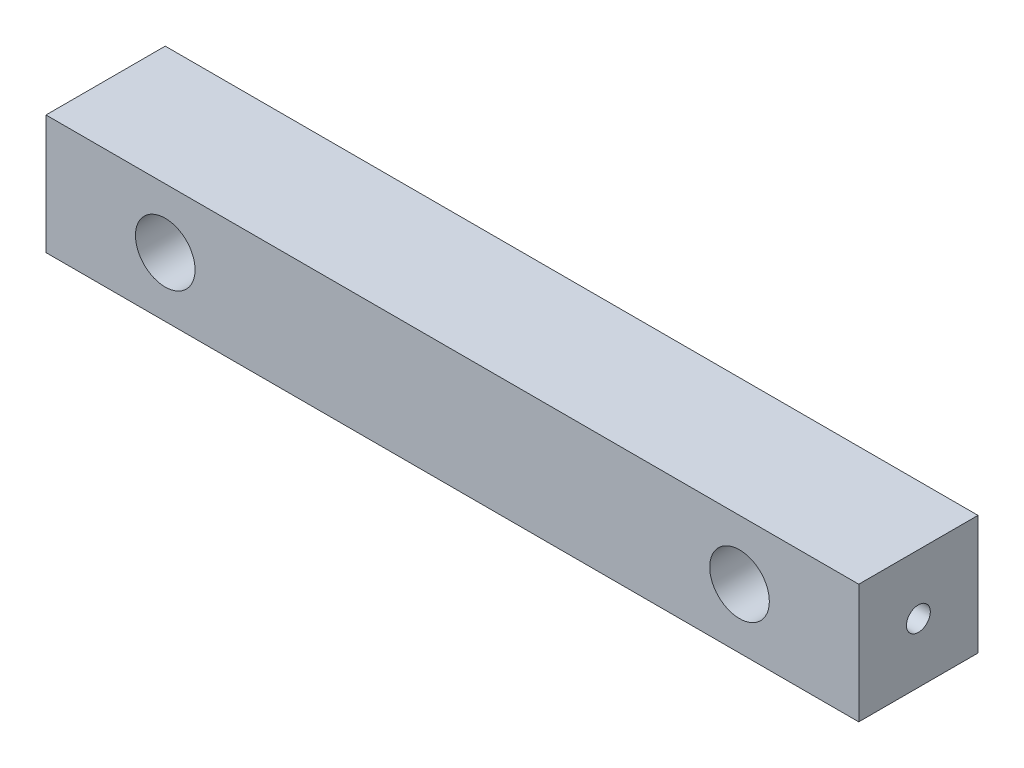
ISO-10303-21;
HEADER;
FILE_DESCRIPTION(('STEP AP214'),'2;1');
FILE_NAME('part.step','',(''),(''),'','','');
FILE_SCHEMA(('AUTOMOTIVE_DESIGN { 1 0 10303 214 1 1 1 1 }'));
ENDSEC;
DATA;
#1=APPLICATION_CONTEXT('core data for automotive mechanical design processes');
#2=APPLICATION_PROTOCOL_DEFINITION('international standard','automotive_design',2000,#1);
#3=PRODUCT_CONTEXT('',#1,'mechanical');
#4=PRODUCT('Part','Part','',(#3));
#5=PRODUCT_RELATED_PRODUCT_CATEGORY('part','',(#4));
#6=PRODUCT_DEFINITION_FORMATION('','',#4);
#7=PRODUCT_DEFINITION_CONTEXT('part definition',#1,'design');
#8=PRODUCT_DEFINITION('design','',#6,#7);
#9=PRODUCT_DEFINITION_SHAPE('','',#8);
#10=(LENGTH_UNIT() NAMED_UNIT(*) SI_UNIT(.MILLI.,.METRE.));
#11=(NAMED_UNIT(*) PLANE_ANGLE_UNIT() SI_UNIT($,.RADIAN.));
#12=(NAMED_UNIT(*) SI_UNIT($,.STERADIAN.) SOLID_ANGLE_UNIT());
#13=UNCERTAINTY_MEASURE_WITH_UNIT(LENGTH_MEASURE(1.E-05),#10,'distance_accuracy_value','');
#14=(GEOMETRIC_REPRESENTATION_CONTEXT(3) GLOBAL_UNCERTAINTY_ASSIGNED_CONTEXT((#13)) GLOBAL_UNIT_ASSIGNED_CONTEXT((#10,
#11,#12)) REPRESENTATION_CONTEXT('',''));
#15=CARTESIAN_POINT('',(0.,0.,0.));
#16=DIRECTION('',(0.,0.,1.));
#17=DIRECTION('',(1.,0.,0.));
#18=AXIS2_PLACEMENT_3D('',#15,#16,#17);
#19=CARTESIAN_POINT('',(0.,0.,20.));
#20=DIRECTION('',(0.,0.,-1.));
#21=DIRECTION('',(-1.,0.,0.));
#22=AXIS2_PLACEMENT_3D('',#19,#20,#21);
#23=PLANE('',#22);
#24=DIRECTION('',(0.,-1.,0.));
#25=VECTOR('',#24,1.);
#26=CARTESIAN_POINT('',(0.,0.,20.));
#27=LINE('',#26,#25);
#28=CARTESIAN_POINT('',(0.,20.,20.));
#29=VERTEX_POINT('',#28);
#30=CARTESIAN_POINT('',(0.,0.,20.));
#31=VERTEX_POINT('',#30);
#32=EDGE_CURVE('E85',#29,#31,#27,.T.);
#33=ORIENTED_EDGE('',*,*,#32,.T.);
#34=DIRECTION('',(1.,0.,0.));
#35=VECTOR('',#34,1.);
#36=CARTESIAN_POINT('',(0.,0.,20.));
#37=LINE('',#36,#35);
#38=CARTESIAN_POINT('',(136.32,0.,20.));
#39=VERTEX_POINT('',#38);
#40=EDGE_CURVE('E80',#31,#39,#37,.T.);
#41=ORIENTED_EDGE('',*,*,#40,.T.);
#42=DIRECTION('',(0.,1.,0.));
#43=VECTOR('',#42,1.);
#44=CARTESIAN_POINT('',(136.32,0.,20.));
#45=LINE('',#44,#43);
#46=CARTESIAN_POINT('',(136.32,20.,20.));
#47=VERTEX_POINT('',#46);
#48=EDGE_CURVE('E83',#39,#47,#45,.T.);
#49=ORIENTED_EDGE('',*,*,#48,.T.);
#50=DIRECTION('',(-1.,0.,0.));
#51=VECTOR('',#50,1.);
#52=CARTESIAN_POINT('',(0.,20.,20.));
#53=LINE('',#52,#51);
#54=EDGE_CURVE('E50',#47,#29,#53,.T.);
#55=ORIENTED_EDGE('',*,*,#54,.T.);
#56=EDGE_LOOP('',(#33,#41,#49,#55));
#57=FACE_BOUND('',#56,.T.);
#58=CARTESIAN_POINT('',(116.32,10.,20.));
#59=DIRECTION('',(0.,0.,1.));
#60=DIRECTION('',(1.,0.,0.));
#61=AXIS2_PLACEMENT_3D('',#58,#59,#60);
#62=CIRCLE('',#61,5.);
#63=CARTESIAN_POINT('',(121.32,10.,20.));
#64=VERTEX_POINT('',#63);
#65=EDGE_CURVE('E100',#64,#64,#62,.T.);
#66=ORIENTED_EDGE('',*,*,#65,.F.);
#67=EDGE_LOOP('',(#66));
#68=FACE_BOUND('',#67,.T.);
#69=CARTESIAN_POINT('',(20.,10.,20.));
#70=DIRECTION('',(0.,0.,1.));
#71=DIRECTION('',(1.,0.,0.));
#72=AXIS2_PLACEMENT_3D('',#69,#70,#71);
#73=CIRCLE('',#72,5.);
#74=CARTESIAN_POINT('',(25.,10.,20.));
#75=VERTEX_POINT('',#74);
#76=EDGE_CURVE('E115',#75,#75,#73,.T.);
#77=ORIENTED_EDGE('',*,*,#76,.F.);
#78=EDGE_LOOP('',(#77));
#79=FACE_BOUND('',#78,.T.);
#80=ADVANCED_FACE('F33',(#57,#68,#79),#23,.F.);
#81=CARTESIAN_POINT('',(0.,0.,0.));
#82=DIRECTION('',(0.,0.,-1.));
#83=DIRECTION('',(-1.,0.,0.));
#84=AXIS2_PLACEMENT_3D('',#81,#82,#83);
#85=PLANE('',#84);
#86=CARTESIAN_POINT('',(116.32,10.,0.));
#87=DIRECTION('',(0.,0.,1.));
#88=DIRECTION('',(1.,0.,0.));
#89=AXIS2_PLACEMENT_3D('',#86,#87,#88);
#90=CIRCLE('',#89,5.);
#91=CARTESIAN_POINT('',(121.32,10.,0.));
#92=VERTEX_POINT('',#91);
#93=EDGE_CURVE('E112',#92,#92,#90,.T.);
#94=ORIENTED_EDGE('',*,*,#93,.T.);
#95=EDGE_LOOP('',(#94));
#96=FACE_BOUND('',#95,.T.);
#97=DIRECTION('',(0.,-1.,0.));
#98=VECTOR('',#97,1.);
#99=CARTESIAN_POINT('',(0.,0.,0.));
#100=LINE('',#99,#98);
#101=CARTESIAN_POINT('',(0.,20.,0.));
#102=VERTEX_POINT('',#101);
#103=CARTESIAN_POINT('',(0.,0.,0.));
#104=VERTEX_POINT('',#103);
#105=EDGE_CURVE('E97',#102,#104,#100,.T.);
#106=ORIENTED_EDGE('',*,*,#105,.F.);
#107=DIRECTION('',(-1.,0.,0.));
#108=VECTOR('',#107,1.);
#109=CARTESIAN_POINT('',(0.,20.,0.));
#110=LINE('',#109,#108);
#111=CARTESIAN_POINT('',(136.32,20.,0.));
#112=VERTEX_POINT('',#111);
#113=EDGE_CURVE('E73',#112,#102,#110,.T.);
#114=ORIENTED_EDGE('',*,*,#113,.F.);
#115=DIRECTION('',(0.,1.,0.));
#116=VECTOR('',#115,1.);
#117=CARTESIAN_POINT('',(136.32,0.,0.));
#118=LINE('',#117,#116);
#119=CARTESIAN_POINT('',(136.32,0.,0.));
#120=VERTEX_POINT('',#119);
#121=EDGE_CURVE('E67',#120,#112,#118,.T.);
#122=ORIENTED_EDGE('',*,*,#121,.F.);
#123=DIRECTION('',(1.,0.,0.));
#124=VECTOR('',#123,1.);
#125=CARTESIAN_POINT('',(0.,0.,0.));
#126=LINE('',#125,#124);
#127=EDGE_CURVE('E89',#104,#120,#126,.T.);
#128=ORIENTED_EDGE('',*,*,#127,.F.);
#129=EDGE_LOOP('',(#106,#114,#122,#128));
#130=FACE_BOUND('',#129,.T.);
#131=CARTESIAN_POINT('',(20.,10.,0.));
#132=DIRECTION('',(0.,0.,1.));
#133=DIRECTION('',(1.,0.,0.));
#134=AXIS2_PLACEMENT_3D('',#131,#132,#133);
#135=CIRCLE('',#134,5.);
#136=CARTESIAN_POINT('',(25.,10.,0.));
#137=VERTEX_POINT('',#136);
#138=EDGE_CURVE('E118',#137,#137,#135,.T.);
#139=ORIENTED_EDGE('',*,*,#138,.T.);
#140=EDGE_LOOP('',(#139));
#141=FACE_BOUND('',#140,.T.);
#142=ADVANCED_FACE('F108',(#96,#130,#141),#85,.T.);
#143=CARTESIAN_POINT('',(0.,0.,20.));
#144=DIRECTION('',(1.,0.,0.));
#145=DIRECTION('',(0.,0.,-1.));
#146=AXIS2_PLACEMENT_3D('',#143,#144,#145);
#147=PLANE('',#146);
#148=CARTESIAN_POINT('',(0.,10.,10.));
#149=DIRECTION('',(-1.,0.,0.));
#150=DIRECTION('',(0.,0.,1.));
#151=AXIS2_PLACEMENT_3D('',#148,#149,#150);
#152=CIRCLE('',#151,2.);
#153=CARTESIAN_POINT('',(0.,10.,12.));
#154=VERTEX_POINT('',#153);
#155=EDGE_CURVE('E124',#154,#154,#152,.T.);
#156=ORIENTED_EDGE('',*,*,#155,.F.);
#157=EDGE_LOOP('',(#156));
#158=FACE_BOUND('',#157,.T.);
#159=ORIENTED_EDGE('',*,*,#105,.T.);
#160=DIRECTION('',(0.,0.,-1.));
#161=VECTOR('',#160,1.);
#162=CARTESIAN_POINT('',(0.,0.,20.));
#163=LINE('',#162,#161);
#164=EDGE_CURVE('E11',#31,#104,#163,.T.);
#165=ORIENTED_EDGE('',*,*,#164,.F.);
#166=ORIENTED_EDGE('',*,*,#32,.F.);
#167=DIRECTION('',(0.,0.,-1.));
#168=VECTOR('',#167,1.);
#169=CARTESIAN_POINT('',(0.,20.,20.));
#170=LINE('',#169,#168);
#171=EDGE_CURVE('E93',#29,#102,#170,.T.);
#172=ORIENTED_EDGE('',*,*,#171,.T.);
#173=EDGE_LOOP('',(#159,#165,#166,#172));
#174=FACE_BOUND('',#173,.T.);
#175=ADVANCED_FACE('F35',(#158,#174),#147,.F.);
#176=CARTESIAN_POINT('',(0.,0.,20.));
#177=DIRECTION('',(0.,1.,0.));
#178=DIRECTION('',(0.,0.,1.));
#179=AXIS2_PLACEMENT_3D('',#176,#177,#178);
#180=PLANE('',#179);
#181=ORIENTED_EDGE('',*,*,#127,.T.);
#182=DIRECTION('',(0.,0.,-1.));
#183=VECTOR('',#182,1.);
#184=CARTESIAN_POINT('',(136.32,0.,20.));
#185=LINE('',#184,#183);
#186=EDGE_CURVE('E42',#39,#120,#185,.T.);
#187=ORIENTED_EDGE('',*,*,#186,.F.);
#188=ORIENTED_EDGE('',*,*,#40,.F.);
#189=ORIENTED_EDGE('',*,*,#164,.T.);
#190=EDGE_LOOP('',(#181,#187,#188,#189));
#191=FACE_BOUND('',#190,.T.);
#192=ADVANCED_FACE('F88',(#191),#180,.F.);
#193=CARTESIAN_POINT('',(136.32,0.,20.));
#194=DIRECTION('',(-1.,0.,0.));
#195=DIRECTION('',(0.,-1.,0.));
#196=AXIS2_PLACEMENT_3D('',#193,#194,#195);
#197=PLANE('',#196);
#198=CARTESIAN_POINT('',(136.32,10.0000000000002,10.));
#199=DIRECTION('',(1.,0.,0.));
#200=DIRECTION('',(0.,1.,0.));
#201=AXIS2_PLACEMENT_3D('',#198,#199,#200);
#202=CIRCLE('',#201,2.);
#203=CARTESIAN_POINT('',(136.32,12.0000000000002,10.));
#204=VERTEX_POINT('',#203);
#205=EDGE_CURVE('E130',#204,#204,#202,.T.);
#206=ORIENTED_EDGE('',*,*,#205,.F.);
#207=EDGE_LOOP('',(#206));
#208=FACE_BOUND('',#207,.T.);
#209=ORIENTED_EDGE('',*,*,#121,.T.);
#210=DIRECTION('',(0.,0.,-1.));
#211=VECTOR('',#210,1.);
#212=CARTESIAN_POINT('',(136.32,20.,20.));
#213=LINE('',#212,#211);
#214=EDGE_CURVE('E90',#47,#112,#213,.T.);
#215=ORIENTED_EDGE('',*,*,#214,.F.);
#216=ORIENTED_EDGE('',*,*,#48,.F.);
#217=ORIENTED_EDGE('',*,*,#186,.T.);
#218=EDGE_LOOP('',(#209,#215,#216,#217));
#219=FACE_BOUND('',#218,.T.);
#220=ADVANCED_FACE('F91',(#208,#219),#197,.F.);
#221=CARTESIAN_POINT('',(0.,20.,20.));
#222=DIRECTION('',(0.,-1.,0.));
#223=DIRECTION('',(0.,0.,-1.));
#224=AXIS2_PLACEMENT_3D('',#221,#222,#223);
#225=PLANE('',#224);
#226=ORIENTED_EDGE('',*,*,#113,.T.);
#227=ORIENTED_EDGE('',*,*,#171,.F.);
#228=ORIENTED_EDGE('',*,*,#54,.F.);
#229=ORIENTED_EDGE('',*,*,#214,.T.);
#230=EDGE_LOOP('',(#226,#227,#228,#229));
#231=FACE_BOUND('',#230,.T.);
#232=ADVANCED_FACE('F105',(#231),#225,.F.);
#233=CARTESIAN_POINT('',(116.32,10.,20.));
#234=DIRECTION('',(0.,0.,-1.));
#235=DIRECTION('',(-1.,0.,0.));
#236=AXIS2_PLACEMENT_3D('',#233,#234,#235);
#237=CYLINDRICAL_SURFACE('',#236,5.);
#238=ORIENTED_EDGE('',*,*,#65,.T.);
#239=EDGE_LOOP('',(#238));
#240=FACE_BOUND('',#239,.T.);
#241=ORIENTED_EDGE('',*,*,#93,.F.);
#242=EDGE_LOOP('',(#241));
#243=FACE_BOUND('',#242,.T.);
#244=ADVANCED_FACE('F151',(#240,#243),#237,.F.);
#245=CARTESIAN_POINT('',(20.,10.,20.));
#246=DIRECTION('',(0.,0.,-1.));
#247=DIRECTION('',(-1.,0.,0.));
#248=AXIS2_PLACEMENT_3D('',#245,#246,#247);
#249=CYLINDRICAL_SURFACE('',#248,5.);
#250=ORIENTED_EDGE('',*,*,#76,.T.);
#251=EDGE_LOOP('',(#250));
#252=FACE_BOUND('',#251,.T.);
#253=ORIENTED_EDGE('',*,*,#138,.F.);
#254=EDGE_LOOP('',(#253));
#255=FACE_BOUND('',#254,.T.);
#256=ADVANCED_FACE('F163',(#252,#255),#249,.F.);
#257=CARTESIAN_POINT('',(7.5,10.,10.));
#258=DIRECTION('',(-1.,0.,0.));
#259=DIRECTION('',(0.,0.,1.));
#260=AXIS2_PLACEMENT_3D('',#257,#258,#259);
#261=CYLINDRICAL_SURFACE('',#260,2.);
#262=CARTESIAN_POINT('',(7.5,10.,10.));
#263=DIRECTION('',(-1.,0.,0.));
#264=DIRECTION('',(0.,0.,1.));
#265=AXIS2_PLACEMENT_3D('',#262,#263,#264);
#266=CIRCLE('',#265,2.);
#267=CARTESIAN_POINT('',(7.5,10.,12.));
#268=VERTEX_POINT('',#267);
#269=EDGE_CURVE('E121',#268,#268,#266,.T.);
#270=ORIENTED_EDGE('',*,*,#269,.F.);
#271=EDGE_LOOP('',(#270));
#272=FACE_BOUND('',#271,.T.);
#273=ORIENTED_EDGE('',*,*,#155,.T.);
#274=EDGE_LOOP('',(#273));
#275=FACE_BOUND('',#274,.T.);
#276=ADVANCED_FACE('F167',(#272,#275),#261,.F.);
#277=CARTESIAN_POINT('',(7.5,10.,10.));
#278=DIRECTION('',(-1.,0.,0.));
#279=DIRECTION('',(0.,0.,1.));
#280=AXIS2_PLACEMENT_3D('',#277,#278,#279);
#281=PLANE('',#280);
#282=ORIENTED_EDGE('',*,*,#269,.T.);
#283=EDGE_LOOP('',(#282));
#284=FACE_BOUND('',#283,.T.);
#285=ADVANCED_FACE('F141',(#284),#281,.T.);
#286=CARTESIAN_POINT('',(128.82,10.0000000000002,10.));
#287=DIRECTION('',(1.,0.,0.));
#288=DIRECTION('',(0.,1.,0.));
#289=AXIS2_PLACEMENT_3D('',#286,#287,#288);
#290=CYLINDRICAL_SURFACE('',#289,2.);
#291=CARTESIAN_POINT('',(128.82,10.0000000000002,10.));
#292=DIRECTION('',(1.,0.,0.));
#293=DIRECTION('',(0.,1.,0.));
#294=AXIS2_PLACEMENT_3D('',#291,#292,#293);
#295=CIRCLE('',#294,2.);
#296=CARTESIAN_POINT('',(128.82,12.0000000000002,10.));
#297=VERTEX_POINT('',#296);
#298=EDGE_CURVE('E127',#297,#297,#295,.T.);
#299=ORIENTED_EDGE('',*,*,#298,.F.);
#300=EDGE_LOOP('',(#299));
#301=FACE_BOUND('',#300,.T.);
#302=ORIENTED_EDGE('',*,*,#205,.T.);
#303=EDGE_LOOP('',(#302));
#304=FACE_BOUND('',#303,.T.);
#305=ADVANCED_FACE('F138',(#301,#304),#290,.F.);
#306=CARTESIAN_POINT('',(128.82,10.0000000000002,10.));
#307=DIRECTION('',(1.,0.,0.));
#308=DIRECTION('',(0.,1.,0.));
#309=AXIS2_PLACEMENT_3D('',#306,#307,#308);
#310=PLANE('',#309);
#311=ORIENTED_EDGE('',*,*,#298,.T.);
#312=EDGE_LOOP('',(#311));
#313=FACE_BOUND('',#312,.T.);
#314=ADVANCED_FACE('F136',(#313),#310,.T.);
#315=CLOSED_SHELL('',(#80,#142,#175,#192,#220,#232,#244,#256,#276,#285,#305,#314));
#316=MANIFOLD_SOLID_BREP('B2',#315);
#317=ADVANCED_BREP_SHAPE_REPRESENTATION('',(#18,#316),#14);
#318=SHAPE_DEFINITION_REPRESENTATION(#9,#317);
ENDSEC;
END-ISO-10303-21;
